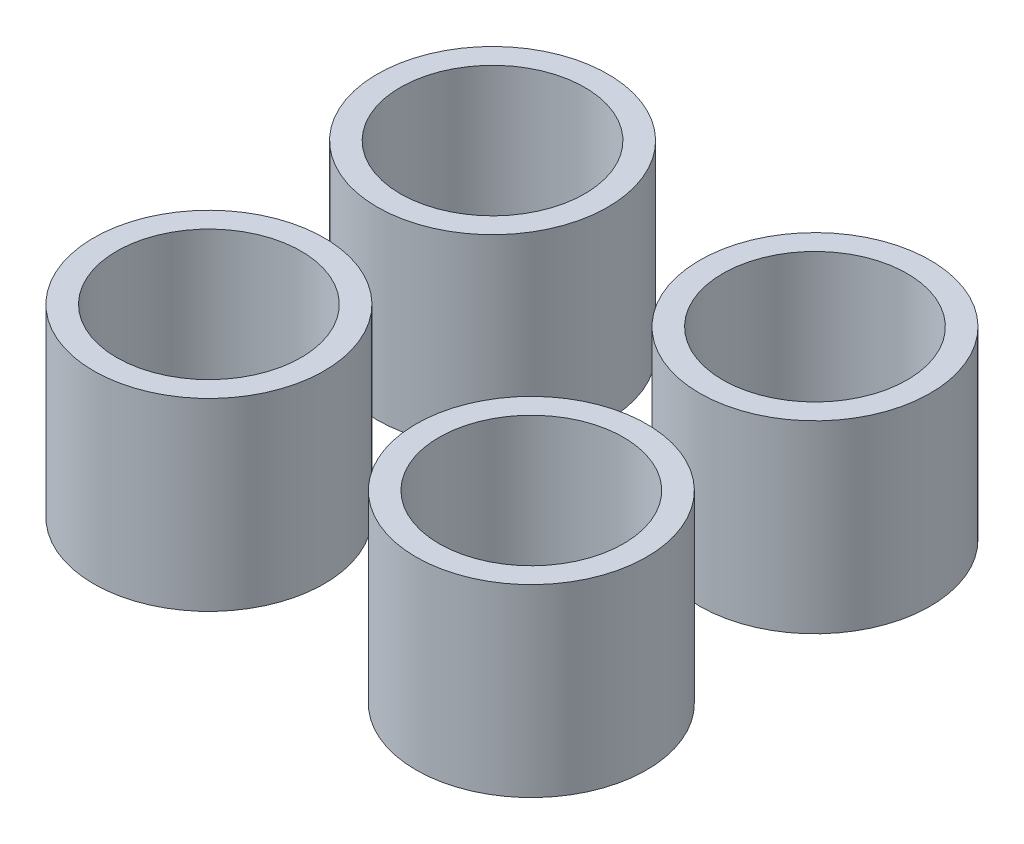
ISO-10303-21;
HEADER;
FILE_DESCRIPTION(('STEP AP214'),'2;1');
FILE_NAME('part.step','',(''),(''),'','','');
FILE_SCHEMA(('AUTOMOTIVE_DESIGN { 1 0 10303 214 1 1 1 1 }'));
ENDSEC;
DATA;
#1=APPLICATION_CONTEXT('core data for automotive mechanical design processes');
#2=APPLICATION_PROTOCOL_DEFINITION('international standard','automotive_design',2000,#1);
#3=PRODUCT_CONTEXT('',#1,'mechanical');
#4=PRODUCT('Part','Part','',(#3));
#5=PRODUCT_RELATED_PRODUCT_CATEGORY('part','',(#4));
#6=PRODUCT_DEFINITION_FORMATION('','',#4);
#7=PRODUCT_DEFINITION_CONTEXT('part definition',#1,'design');
#8=PRODUCT_DEFINITION('design','',#6,#7);
#9=PRODUCT_DEFINITION_SHAPE('','',#8);
#10=(LENGTH_UNIT() NAMED_UNIT(*) SI_UNIT(.MILLI.,.METRE.));
#11=(NAMED_UNIT(*) PLANE_ANGLE_UNIT() SI_UNIT($,.RADIAN.));
#12=(NAMED_UNIT(*) SI_UNIT($,.STERADIAN.) SOLID_ANGLE_UNIT());
#13=UNCERTAINTY_MEASURE_WITH_UNIT(LENGTH_MEASURE(1.E-05),#10,'distance_accuracy_value','');
#14=(GEOMETRIC_REPRESENTATION_CONTEXT(3) GLOBAL_UNCERTAINTY_ASSIGNED_CONTEXT((#13)) GLOBAL_UNIT_ASSIGNED_CONTEXT((#10,
#11,#12)) REPRESENTATION_CONTEXT('',''));
#15=CARTESIAN_POINT('',(0.,0.,0.));
#16=DIRECTION('',(0.,0.,1.));
#17=DIRECTION('',(1.,0.,0.));
#18=AXIS2_PLACEMENT_3D('',#15,#16,#17);
#19=CARTESIAN_POINT('',(0.,4.,6.151493795202));
#20=DIRECTION('',(0.,-1.,0.));
#21=DIRECTION('',(0.,0.,-1.));
#22=AXIS2_PLACEMENT_3D('',#19,#20,#21);
#23=CYLINDRICAL_SURFACE('',#22,2.5);
#24=CARTESIAN_POINT('',(0.,4.,6.151493795202));
#25=DIRECTION('',(0.,1.,0.));
#26=DIRECTION('',(0.,0.,1.));
#27=AXIS2_PLACEMENT_3D('',#24,#25,#26);
#28=CIRCLE('',#27,2.5);
#29=CARTESIAN_POINT('',(0.,4.,8.651493795202));
#30=VERTEX_POINT('',#29);
#31=EDGE_CURVE('E53',#30,#30,#28,.T.);
#32=ORIENTED_EDGE('',*,*,#31,.F.);
#33=EDGE_LOOP('',(#32));
#34=FACE_BOUND('',#33,.T.);
#35=CARTESIAN_POINT('',(0.,0.,6.151493795202));
#36=DIRECTION('',(0.,1.,0.));
#37=DIRECTION('',(0.,0.,1.));
#38=AXIS2_PLACEMENT_3D('',#35,#36,#37);
#39=CIRCLE('',#38,2.5);
#40=CARTESIAN_POINT('',(0.,0.,8.651493795202));
#41=VERTEX_POINT('',#40);
#42=EDGE_CURVE('E11',#41,#41,#39,.T.);
#43=ORIENTED_EDGE('',*,*,#42,.T.);
#44=EDGE_LOOP('',(#43));
#45=FACE_BOUND('',#44,.T.);
#46=ADVANCED_FACE('F46',(#34,#45),#23,.T.);
#47=CARTESIAN_POINT('',(0.,4.,6.151493795202));
#48=DIRECTION('',(0.,1.,0.));
#49=DIRECTION('',(0.,0.,1.));
#50=AXIS2_PLACEMENT_3D('',#47,#48,#49);
#51=PLANE('',#50);
#52=CARTESIAN_POINT('',(0.,4.,6.151493795202));
#53=DIRECTION('',(0.,1.,0.));
#54=DIRECTION('',(0.,0.,1.));
#55=AXIS2_PLACEMENT_3D('',#52,#53,#54);
#56=CIRCLE('',#55,2.);
#57=CARTESIAN_POINT('',(0.,4.,8.151493795202));
#58=VERTEX_POINT('',#57);
#59=EDGE_CURVE('E58',#58,#58,#56,.T.);
#60=ORIENTED_EDGE('',*,*,#59,.F.);
#61=EDGE_LOOP('',(#60));
#62=FACE_BOUND('',#61,.T.);
#63=ORIENTED_EDGE('',*,*,#31,.T.);
#64=EDGE_LOOP('',(#63));
#65=FACE_BOUND('',#64,.T.);
#66=ADVANCED_FACE('F48',(#62,#65),#51,.T.);
#67=CARTESIAN_POINT('',(0.,0.,6.151493795202));
#68=DIRECTION('',(0.,1.,0.));
#69=DIRECTION('',(0.,0.,1.));
#70=AXIS2_PLACEMENT_3D('',#67,#68,#69);
#71=PLANE('',#70);
#72=CARTESIAN_POINT('',(0.,0.,6.151493795202));
#73=DIRECTION('',(0.,1.,0.));
#74=DIRECTION('',(0.,0.,1.));
#75=AXIS2_PLACEMENT_3D('',#72,#73,#74);
#76=CIRCLE('',#75,2.);
#77=CARTESIAN_POINT('',(0.,0.,8.151493795202));
#78=VERTEX_POINT('',#77);
#79=EDGE_CURVE('E49',#78,#78,#76,.T.);
#80=ORIENTED_EDGE('',*,*,#79,.T.);
#81=EDGE_LOOP('',(#80));
#82=FACE_BOUND('',#81,.T.);
#83=ORIENTED_EDGE('',*,*,#42,.F.);
#84=EDGE_LOOP('',(#83));
#85=FACE_BOUND('',#84,.T.);
#86=ADVANCED_FACE('F66',(#82,#85),#71,.F.);
#87=CARTESIAN_POINT('',(0.,-1.,6.151493795202));
#88=DIRECTION('',(0.,1.,0.));
#89=DIRECTION('',(0.,0.,1.));
#90=AXIS2_PLACEMENT_3D('',#87,#88,#89);
#91=CYLINDRICAL_SURFACE('',#90,2.);
#92=ORIENTED_EDGE('',*,*,#59,.T.);
#93=EDGE_LOOP('',(#92));
#94=FACE_BOUND('',#93,.T.);
#95=ORIENTED_EDGE('',*,*,#79,.F.);
#96=EDGE_LOOP('',(#95));
#97=FACE_BOUND('',#96,.T.);
#98=ADVANCED_FACE('F67',(#94,#97),#91,.F.);
#99=CLOSED_SHELL('',(#46,#66,#86,#98));
#100=MANIFOLD_SOLID_BREP('B2',#99);
#101=CARTESIAN_POINT('',(-6.99207058709295,4.,6.151493795202));
#102=DIRECTION('',(0.,-1.,0.));
#103=DIRECTION('',(0.,0.,-1.));
#104=AXIS2_PLACEMENT_3D('',#101,#102,#103);
#105=CYLINDRICAL_SURFACE('',#104,2.5);
#106=CARTESIAN_POINT('',(-6.99207058709295,4.,6.151493795202));
#107=DIRECTION('',(0.,1.,0.));
#108=DIRECTION('',(0.,0.,1.));
#109=AXIS2_PLACEMENT_3D('',#106,#107,#108);
#110=CIRCLE('',#109,2.5);
#111=CARTESIAN_POINT('',(-6.99207058709295,4.,8.651493795202));
#112=VERTEX_POINT('',#111);
#113=EDGE_CURVE('E123',#112,#112,#110,.T.);
#114=ORIENTED_EDGE('',*,*,#113,.F.);
#115=EDGE_LOOP('',(#114));
#116=FACE_BOUND('',#115,.T.);
#117=CARTESIAN_POINT('',(-6.99207058709295,0.,6.151493795202));
#118=DIRECTION('',(0.,1.,0.));
#119=DIRECTION('',(0.,0.,1.));
#120=AXIS2_PLACEMENT_3D('',#117,#118,#119);
#121=CIRCLE('',#120,2.5);
#122=CARTESIAN_POINT('',(-6.99207058709295,0.,8.651493795202));
#123=VERTEX_POINT('',#122);
#124=EDGE_CURVE('E44',#123,#123,#121,.T.);
#125=ORIENTED_EDGE('',*,*,#124,.T.);
#126=EDGE_LOOP('',(#125));
#127=FACE_BOUND('',#126,.T.);
#128=ADVANCED_FACE('F117',(#116,#127),#105,.T.);
#129=CARTESIAN_POINT('',(-6.99207058709295,4.,6.151493795202));
#130=DIRECTION('',(0.,1.,0.));
#131=DIRECTION('',(0.,0.,1.));
#132=AXIS2_PLACEMENT_3D('',#129,#130,#131);
#133=PLANE('',#132);
#134=CARTESIAN_POINT('',(-6.99207058709295,4.,6.151493795202));
#135=DIRECTION('',(0.,1.,0.));
#136=DIRECTION('',(0.,0.,1.));
#137=AXIS2_PLACEMENT_3D('',#134,#135,#136);
#138=CIRCLE('',#137,2.);
#139=CARTESIAN_POINT('',(-6.99207058709295,4.,8.151493795202));
#140=VERTEX_POINT('',#139);
#141=EDGE_CURVE('E128',#140,#140,#138,.T.);
#142=ORIENTED_EDGE('',*,*,#141,.F.);
#143=EDGE_LOOP('',(#142));
#144=FACE_BOUND('',#143,.T.);
#145=ORIENTED_EDGE('',*,*,#113,.T.);
#146=EDGE_LOOP('',(#145));
#147=FACE_BOUND('',#146,.T.);
#148=ADVANCED_FACE('F119',(#144,#147),#133,.T.);
#149=CARTESIAN_POINT('',(-6.99207058709295,0.,6.151493795202));
#150=DIRECTION('',(0.,1.,0.));
#151=DIRECTION('',(0.,0.,1.));
#152=AXIS2_PLACEMENT_3D('',#149,#150,#151);
#153=PLANE('',#152);
#154=CARTESIAN_POINT('',(-6.99207058709295,0.,6.151493795202));
#155=DIRECTION('',(0.,1.,0.));
#156=DIRECTION('',(0.,0.,1.));
#157=AXIS2_PLACEMENT_3D('',#154,#155,#156);
#158=CIRCLE('',#157,2.);
#159=CARTESIAN_POINT('',(-6.99207058709295,0.,8.151493795202));
#160=VERTEX_POINT('',#159);
#161=EDGE_CURVE('E118',#160,#160,#158,.T.);
#162=ORIENTED_EDGE('',*,*,#161,.T.);
#163=EDGE_LOOP('',(#162));
#164=FACE_BOUND('',#163,.T.);
#165=ORIENTED_EDGE('',*,*,#124,.F.);
#166=EDGE_LOOP('',(#165));
#167=FACE_BOUND('',#166,.T.);
#168=ADVANCED_FACE('F136',(#164,#167),#153,.F.);
#169=CARTESIAN_POINT('',(-6.99207058709295,-1.,6.151493795202));
#170=DIRECTION('',(0.,1.,0.));
#171=DIRECTION('',(0.,0.,1.));
#172=AXIS2_PLACEMENT_3D('',#169,#170,#171);
#173=CYLINDRICAL_SURFACE('',#172,2.);
#174=ORIENTED_EDGE('',*,*,#141,.T.);
#175=EDGE_LOOP('',(#174));
#176=FACE_BOUND('',#175,.T.);
#177=ORIENTED_EDGE('',*,*,#161,.F.);
#178=EDGE_LOOP('',(#177));
#179=FACE_BOUND('',#178,.T.);
#180=ADVANCED_FACE('F137',(#176,#179),#173,.F.);
#181=CLOSED_SHELL('',(#128,#148,#168,#180));
#182=MANIFOLD_SOLID_BREP('B6',#181);
#183=CARTESIAN_POINT('',(-6.99207058709295,4.,0.));
#184=DIRECTION('',(0.,-1.,0.));
#185=DIRECTION('',(0.,0.,-1.));
#186=AXIS2_PLACEMENT_3D('',#183,#184,#185);
#187=CYLINDRICAL_SURFACE('',#186,2.5);
#188=CARTESIAN_POINT('',(-6.99207058709295,4.,0.));
#189=DIRECTION('',(0.,1.,0.));
#190=DIRECTION('',(0.,0.,1.));
#191=AXIS2_PLACEMENT_3D('',#188,#189,#190);
#192=CIRCLE('',#191,2.5);
#193=CARTESIAN_POINT('',(-6.99207058709295,4.,2.5));
#194=VERTEX_POINT('',#193);
#195=EDGE_CURVE('E195',#194,#194,#192,.T.);
#196=ORIENTED_EDGE('',*,*,#195,.F.);
#197=EDGE_LOOP('',(#196));
#198=FACE_BOUND('',#197,.T.);
#199=CARTESIAN_POINT('',(-6.99207058709295,0.,0.));
#200=DIRECTION('',(0.,1.,0.));
#201=DIRECTION('',(0.,0.,1.));
#202=AXIS2_PLACEMENT_3D('',#199,#200,#201);
#203=CIRCLE('',#202,2.5);
#204=CARTESIAN_POINT('',(-6.99207058709295,0.,2.5));
#205=VERTEX_POINT('',#204);
#206=EDGE_CURVE('E113',#205,#205,#203,.T.);
#207=ORIENTED_EDGE('',*,*,#206,.T.);
#208=EDGE_LOOP('',(#207));
#209=FACE_BOUND('',#208,.T.);
#210=ADVANCED_FACE('F183',(#198,#209),#187,.T.);
#211=CARTESIAN_POINT('',(-6.99207058709295,4.,0.));
#212=DIRECTION('',(0.,1.,0.));
#213=DIRECTION('',(0.,0.,1.));
#214=AXIS2_PLACEMENT_3D('',#211,#212,#213);
#215=PLANE('',#214);
#216=CARTESIAN_POINT('',(-6.99207058709295,4.,0.));
#217=DIRECTION('',(0.,1.,0.));
#218=DIRECTION('',(0.,0.,1.));
#219=AXIS2_PLACEMENT_3D('',#216,#217,#218);
#220=CIRCLE('',#219,2.);
#221=CARTESIAN_POINT('',(-6.99207058709295,4.,2.));
#222=VERTEX_POINT('',#221);
#223=EDGE_CURVE('E200',#222,#222,#220,.T.);
#224=ORIENTED_EDGE('',*,*,#223,.F.);
#225=EDGE_LOOP('',(#224));
#226=FACE_BOUND('',#225,.T.);
#227=ORIENTED_EDGE('',*,*,#195,.T.);
#228=EDGE_LOOP('',(#227));
#229=FACE_BOUND('',#228,.T.);
#230=ADVANCED_FACE('F190',(#226,#229),#215,.T.);
#231=CARTESIAN_POINT('',(-6.99207058709295,0.,0.));
#232=DIRECTION('',(0.,1.,0.));
#233=DIRECTION('',(0.,0.,1.));
#234=AXIS2_PLACEMENT_3D('',#231,#232,#233);
#235=PLANE('',#234);
#236=CARTESIAN_POINT('',(-6.99207058709295,0.,0.));
#237=DIRECTION('',(0.,1.,0.));
#238=DIRECTION('',(0.,0.,1.));
#239=AXIS2_PLACEMENT_3D('',#236,#237,#238);
#240=CIRCLE('',#239,2.);
#241=CARTESIAN_POINT('',(-6.99207058709295,0.,2.));
#242=VERTEX_POINT('',#241);
#243=EDGE_CURVE('E186',#242,#242,#240,.T.);
#244=ORIENTED_EDGE('',*,*,#243,.T.);
#245=EDGE_LOOP('',(#244));
#246=FACE_BOUND('',#245,.T.);
#247=ORIENTED_EDGE('',*,*,#206,.F.);
#248=EDGE_LOOP('',(#247));
#249=FACE_BOUND('',#248,.T.);
#250=ADVANCED_FACE('F206',(#246,#249),#235,.F.);
#251=CARTESIAN_POINT('',(-6.99207058709295,-1.,0.));
#252=DIRECTION('',(0.,1.,0.));
#253=DIRECTION('',(0.,0.,1.));
#254=AXIS2_PLACEMENT_3D('',#251,#252,#253);
#255=CYLINDRICAL_SURFACE('',#254,2.);
#256=ORIENTED_EDGE('',*,*,#223,.T.);
#257=EDGE_LOOP('',(#256));
#258=FACE_BOUND('',#257,.T.);
#259=ORIENTED_EDGE('',*,*,#243,.F.);
#260=EDGE_LOOP('',(#259));
#261=FACE_BOUND('',#260,.T.);
#262=ADVANCED_FACE('F207',(#258,#261),#255,.F.);
#263=CLOSED_SHELL('',(#210,#230,#250,#262));
#264=MANIFOLD_SOLID_BREP('B37',#263);
#265=CARTESIAN_POINT('',(0.,4.,0.));
#266=DIRECTION('',(0.,-1.,0.));
#267=DIRECTION('',(0.,0.,-1.));
#268=AXIS2_PLACEMENT_3D('',#265,#266,#267);
#269=CYLINDRICAL_SURFACE('',#268,2.5);
#270=CARTESIAN_POINT('',(0.,4.,0.));
#271=DIRECTION('',(0.,1.,0.));
#272=DIRECTION('',(0.,0.,1.));
#273=AXIS2_PLACEMENT_3D('',#270,#271,#272);
#274=CIRCLE('',#273,2.5);
#275=CARTESIAN_POINT('',(0.,4.,2.5));
#276=VERTEX_POINT('',#275);
#277=EDGE_CURVE('E184',#276,#276,#274,.T.);
#278=ORIENTED_EDGE('',*,*,#277,.F.);
#279=EDGE_LOOP('',(#278));
#280=FACE_BOUND('',#279,.T.);
#281=CARTESIAN_POINT('',(0.,0.,0.));
#282=DIRECTION('',(0.,1.,0.));
#283=DIRECTION('',(0.,0.,1.));
#284=AXIS2_PLACEMENT_3D('',#281,#282,#283);
#285=CIRCLE('',#284,2.5);
#286=CARTESIAN_POINT('',(0.,0.,2.5));
#287=VERTEX_POINT('',#286);
#288=EDGE_CURVE('E255',#287,#287,#285,.T.);
#289=ORIENTED_EDGE('',*,*,#288,.T.);
#290=EDGE_LOOP('',(#289));
#291=FACE_BOUND('',#290,.T.);
#292=ADVANCED_FACE('F246',(#280,#291),#269,.T.);
#293=CARTESIAN_POINT('',(0.,4.,0.));
#294=DIRECTION('',(0.,1.,0.));
#295=DIRECTION('',(0.,0.,1.));
#296=AXIS2_PLACEMENT_3D('',#293,#294,#295);
#297=PLANE('',#296);
#298=CARTESIAN_POINT('',(0.,4.,0.));
#299=DIRECTION('',(0.,1.,0.));
#300=DIRECTION('',(0.,0.,1.));
#301=AXIS2_PLACEMENT_3D('',#298,#299,#300);
#302=CIRCLE('',#301,2.);
#303=CARTESIAN_POINT('',(0.,4.,2.));
#304=VERTEX_POINT('',#303);
#305=EDGE_CURVE('E257',#304,#304,#302,.T.);
#306=ORIENTED_EDGE('',*,*,#305,.F.);
#307=EDGE_LOOP('',(#306));
#308=FACE_BOUND('',#307,.T.);
#309=ORIENTED_EDGE('',*,*,#277,.T.);
#310=EDGE_LOOP('',(#309));
#311=FACE_BOUND('',#310,.T.);
#312=ADVANCED_FACE('F277',(#308,#311),#297,.T.);
#313=CARTESIAN_POINT('',(0.,0.,0.));
#314=DIRECTION('',(0.,1.,0.));
#315=DIRECTION('',(0.,0.,1.));
#316=AXIS2_PLACEMENT_3D('',#313,#314,#315);
#317=PLANE('',#316);
#318=CARTESIAN_POINT('',(0.,0.,0.));
#319=DIRECTION('',(0.,1.,0.));
#320=DIRECTION('',(0.,0.,1.));
#321=AXIS2_PLACEMENT_3D('',#318,#319,#320);
#322=CIRCLE('',#321,2.);
#323=CARTESIAN_POINT('',(0.,0.,2.));
#324=VERTEX_POINT('',#323);
#325=EDGE_CURVE('E247',#324,#324,#322,.T.);
#326=ORIENTED_EDGE('',*,*,#325,.T.);
#327=EDGE_LOOP('',(#326));
#328=FACE_BOUND('',#327,.T.);
#329=ORIENTED_EDGE('',*,*,#288,.F.);
#330=EDGE_LOOP('',(#329));
#331=FACE_BOUND('',#330,.T.);
#332=ADVANCED_FACE('F270',(#328,#331),#317,.F.);
#333=CARTESIAN_POINT('',(0.,-1.,0.));
#334=DIRECTION('',(0.,1.,0.));
#335=DIRECTION('',(0.,0.,1.));
#336=AXIS2_PLACEMENT_3D('',#333,#334,#335);
#337=CYLINDRICAL_SURFACE('',#336,2.);
#338=ORIENTED_EDGE('',*,*,#305,.T.);
#339=EDGE_LOOP('',(#338));
#340=FACE_BOUND('',#339,.T.);
#341=ORIENTED_EDGE('',*,*,#325,.F.);
#342=EDGE_LOOP('',(#341));
#343=FACE_BOUND('',#342,.T.);
#344=ADVANCED_FACE('F269',(#340,#343),#337,.F.);
#345=CLOSED_SHELL('',(#292,#312,#332,#344));
#346=MANIFOLD_SOLID_BREP('B109',#345);
#347=ADVANCED_BREP_SHAPE_REPRESENTATION('',(#18,#100,#182,#264,#346),#14);
#348=SHAPE_DEFINITION_REPRESENTATION(#9,#347);
ENDSEC;
END-ISO-10303-21;
